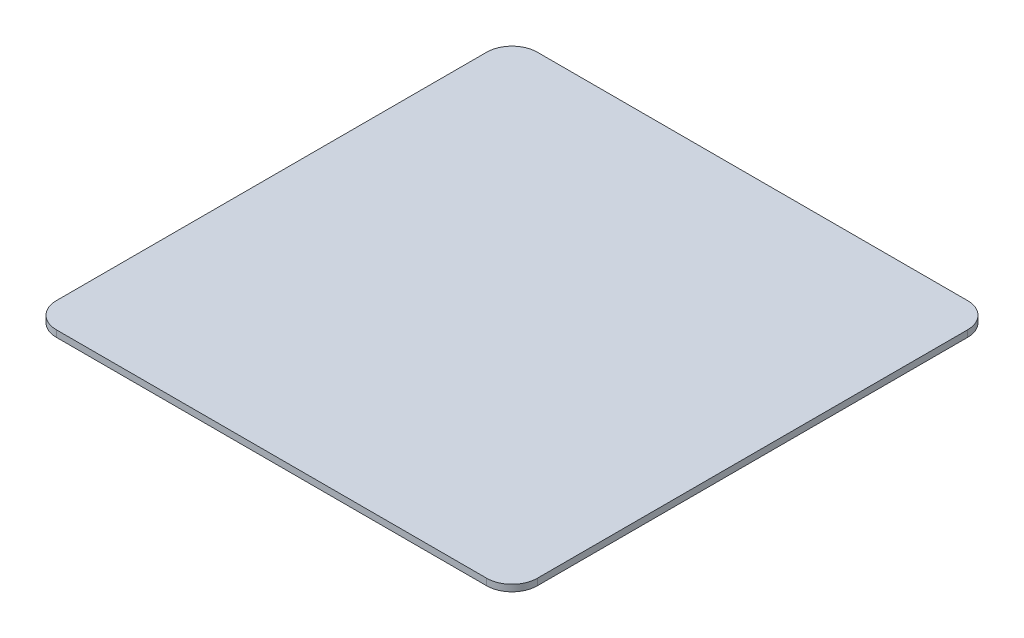
ISO-10303-21;
HEADER;
FILE_DESCRIPTION(('STEP AP214'),'2;1');
FILE_NAME('part.step','',(''),(''),'','','');
FILE_SCHEMA(('AUTOMOTIVE_DESIGN { 1 0 10303 214 1 1 1 1 }'));
ENDSEC;
DATA;
#1=APPLICATION_CONTEXT('core data for automotive mechanical design processes');
#2=APPLICATION_PROTOCOL_DEFINITION('international standard','automotive_design',2000,#1);
#3=PRODUCT_CONTEXT('',#1,'mechanical');
#4=PRODUCT('Part','Part','',(#3));
#5=PRODUCT_RELATED_PRODUCT_CATEGORY('part','',(#4));
#6=PRODUCT_DEFINITION_FORMATION('','',#4);
#7=PRODUCT_DEFINITION_CONTEXT('part definition',#1,'design');
#8=PRODUCT_DEFINITION('design','',#6,#7);
#9=PRODUCT_DEFINITION_SHAPE('','',#8);
#10=(LENGTH_UNIT() NAMED_UNIT(*) SI_UNIT(.MILLI.,.METRE.));
#11=(NAMED_UNIT(*) PLANE_ANGLE_UNIT() SI_UNIT($,.RADIAN.));
#12=(NAMED_UNIT(*) SI_UNIT($,.STERADIAN.) SOLID_ANGLE_UNIT());
#13=UNCERTAINTY_MEASURE_WITH_UNIT(LENGTH_MEASURE(1.E-05),#10,'distance_accuracy_value','');
#14=(GEOMETRIC_REPRESENTATION_CONTEXT(3) GLOBAL_UNCERTAINTY_ASSIGNED_CONTEXT((#13)) GLOBAL_UNIT_ASSIGNED_CONTEXT((#10,
#11,#12)) REPRESENTATION_CONTEXT('',''));
#15=CARTESIAN_POINT('',(0.,0.,0.));
#16=DIRECTION('',(0.,0.,1.));
#17=DIRECTION('',(1.,0.,0.));
#18=AXIS2_PLACEMENT_3D('',#15,#16,#17);
#19=CARTESIAN_POINT('',(47.5,0.65,47.5));
#20=DIRECTION('',(-1.,0.,0.));
#21=DIRECTION('',(0.,0.,1.));
#22=AXIS2_PLACEMENT_3D('',#19,#20,#21);
#23=PLANE('',#22);
#24=DIRECTION('',(0.,0.,-1.));
#25=VECTOR('',#24,1.);
#26=CARTESIAN_POINT('',(47.5,-0.65,47.5));
#27=LINE('',#26,#25);
#28=CARTESIAN_POINT('',(47.5,-0.65,42.5));
#29=VERTEX_POINT('',#28);
#30=CARTESIAN_POINT('',(47.5,-0.65,-42.5));
#31=VERTEX_POINT('',#30);
#32=EDGE_CURVE('E140',#29,#31,#27,.T.);
#33=ORIENTED_EDGE('',*,*,#32,.T.);
#34=DIRECTION('',(0.,-1.,0.));
#35=VECTOR('',#34,1.);
#36=CARTESIAN_POINT('',(47.5,0.65,-42.5));
#37=LINE('',#36,#35);
#38=CARTESIAN_POINT('',(47.5,0.65,-42.5));
#39=VERTEX_POINT('',#38);
#40=EDGE_CURVE('E174',#31,#39,#37,.F.);
#41=ORIENTED_EDGE('',*,*,#40,.T.);
#42=DIRECTION('',(0.,0.,-1.));
#43=VECTOR('',#42,1.);
#44=CARTESIAN_POINT('',(47.5,0.65,47.5));
#45=LINE('',#44,#43);
#46=CARTESIAN_POINT('',(47.5,0.65,42.5));
#47=VERTEX_POINT('',#46);
#48=EDGE_CURVE('E138',#47,#39,#45,.T.);
#49=ORIENTED_EDGE('',*,*,#48,.F.);
#50=DIRECTION('',(0.,-1.,0.));
#51=VECTOR('',#50,1.);
#52=CARTESIAN_POINT('',(47.5,0.65,42.5));
#53=LINE('',#52,#51);
#54=EDGE_CURVE('E170',#47,#29,#53,.T.);
#55=ORIENTED_EDGE('',*,*,#54,.T.);
#56=EDGE_LOOP('',(#33,#41,#49,#55));
#57=FACE_BOUND('',#56,.T.);
#58=ADVANCED_FACE('F39',(#57),#23,.F.);
#59=CARTESIAN_POINT('',(-47.5,0.65,-47.5));
#60=DIRECTION('',(0.,0.,1.));
#61=DIRECTION('',(1.,0.,0.));
#62=AXIS2_PLACEMENT_3D('',#59,#60,#61);
#63=PLANE('',#62);
#64=DIRECTION('',(-1.,0.,0.));
#65=VECTOR('',#64,1.);
#66=CARTESIAN_POINT('',(-47.5,-0.65,-47.5));
#67=LINE('',#66,#65);
#68=CARTESIAN_POINT('',(42.5,-0.65,-47.5));
#69=VERTEX_POINT('',#68);
#70=CARTESIAN_POINT('',(-42.5,-0.65,-47.5));
#71=VERTEX_POINT('',#70);
#72=EDGE_CURVE('E134',#69,#71,#67,.T.);
#73=ORIENTED_EDGE('',*,*,#72,.T.);
#74=DIRECTION('',(0.,-1.,0.));
#75=VECTOR('',#74,1.);
#76=CARTESIAN_POINT('',(-42.5,0.65,-47.5));
#77=LINE('',#76,#75);
#78=CARTESIAN_POINT('',(-42.5,0.65,-47.5));
#79=VERTEX_POINT('',#78);
#80=EDGE_CURVE('E110',#71,#79,#77,.F.);
#81=ORIENTED_EDGE('',*,*,#80,.T.);
#82=DIRECTION('',(-1.,0.,0.));
#83=VECTOR('',#82,1.);
#84=CARTESIAN_POINT('',(-47.5,0.65,-47.5));
#85=LINE('',#84,#83);
#86=CARTESIAN_POINT('',(42.5,0.65,-47.5));
#87=VERTEX_POINT('',#86);
#88=EDGE_CURVE('E193',#87,#79,#85,.T.);
#89=ORIENTED_EDGE('',*,*,#88,.F.);
#90=DIRECTION('',(0.,-1.,0.));
#91=VECTOR('',#90,1.);
#92=CARTESIAN_POINT('',(42.5,0.65,-47.5));
#93=LINE('',#92,#91);
#94=EDGE_CURVE('E116',#87,#69,#93,.T.);
#95=ORIENTED_EDGE('',*,*,#94,.T.);
#96=EDGE_LOOP('',(#73,#81,#89,#95));
#97=FACE_BOUND('',#96,.T.);
#98=ADVANCED_FACE('F214',(#97),#63,.F.);
#99=CARTESIAN_POINT('',(-47.5,0.65,47.5));
#100=DIRECTION('',(1.,0.,0.));
#101=DIRECTION('',(0.,0.,-1.));
#102=AXIS2_PLACEMENT_3D('',#99,#100,#101);
#103=PLANE('',#102);
#104=DIRECTION('',(0.,0.,1.));
#105=VECTOR('',#104,1.);
#106=CARTESIAN_POINT('',(-47.5,0.65,47.5));
#107=LINE('',#106,#105);
#108=CARTESIAN_POINT('',(-47.5,0.65,-42.5));
#109=VERTEX_POINT('',#108);
#110=CARTESIAN_POINT('',(-47.5,0.65,42.5));
#111=VERTEX_POINT('',#110);
#112=EDGE_CURVE('E125',#109,#111,#107,.T.);
#113=ORIENTED_EDGE('',*,*,#112,.F.);
#114=DIRECTION('',(0.,-1.,0.));
#115=VECTOR('',#114,1.);
#116=CARTESIAN_POINT('',(-47.5,0.65,-42.5));
#117=LINE('',#116,#115);
#118=CARTESIAN_POINT('',(-47.5,-0.65,-42.5));
#119=VERTEX_POINT('',#118);
#120=EDGE_CURVE('E109',#109,#119,#117,.T.);
#121=ORIENTED_EDGE('',*,*,#120,.T.);
#122=DIRECTION('',(0.,0.,1.));
#123=VECTOR('',#122,1.);
#124=CARTESIAN_POINT('',(-47.5,-0.65,47.5));
#125=LINE('',#124,#123);
#126=CARTESIAN_POINT('',(-47.5,-0.65,42.5));
#127=VERTEX_POINT('',#126);
#128=EDGE_CURVE('E123',#119,#127,#125,.T.);
#129=ORIENTED_EDGE('',*,*,#128,.T.);
#130=DIRECTION('',(0.,-1.,0.));
#131=VECTOR('',#130,1.);
#132=CARTESIAN_POINT('',(-47.5,0.65,42.5));
#133=LINE('',#132,#131);
#134=EDGE_CURVE('E128',#127,#111,#133,.F.);
#135=ORIENTED_EDGE('',*,*,#134,.T.);
#136=EDGE_LOOP('',(#113,#121,#129,#135));
#137=FACE_BOUND('',#136,.T.);
#138=ADVANCED_FACE('F122',(#137),#103,.F.);
#139=CARTESIAN_POINT('',(-47.5,0.65,47.5));
#140=DIRECTION('',(0.,0.,-1.));
#141=DIRECTION('',(-1.,0.,0.));
#142=AXIS2_PLACEMENT_3D('',#139,#140,#141);
#143=PLANE('',#142);
#144=DIRECTION('',(1.,0.,0.));
#145=VECTOR('',#144,1.);
#146=CARTESIAN_POINT('',(-47.5,-0.65,47.5));
#147=LINE('',#146,#145);
#148=CARTESIAN_POINT('',(-42.5,-0.65,47.5));
#149=VERTEX_POINT('',#148);
#150=CARTESIAN_POINT('',(42.5,-0.65,47.5));
#151=VERTEX_POINT('',#150);
#152=EDGE_CURVE('E133',#149,#151,#147,.T.);
#153=ORIENTED_EDGE('',*,*,#152,.T.);
#154=DIRECTION('',(0.,-1.,0.));
#155=VECTOR('',#154,1.);
#156=CARTESIAN_POINT('',(42.5,0.65,47.5));
#157=LINE('',#156,#155);
#158=CARTESIAN_POINT('',(42.5,0.65,47.5));
#159=VERTEX_POINT('',#158);
#160=EDGE_CURVE('E11',#151,#159,#157,.F.);
#161=ORIENTED_EDGE('',*,*,#160,.T.);
#162=DIRECTION('',(1.,0.,0.));
#163=VECTOR('',#162,1.);
#164=CARTESIAN_POINT('',(-47.5,0.65,47.5));
#165=LINE('',#164,#163);
#166=CARTESIAN_POINT('',(-42.5,0.65,47.5));
#167=VERTEX_POINT('',#166);
#168=EDGE_CURVE('E145',#167,#159,#165,.T.);
#169=ORIENTED_EDGE('',*,*,#168,.F.);
#170=DIRECTION('',(0.,-1.,0.));
#171=VECTOR('',#170,1.);
#172=CARTESIAN_POINT('',(-42.5,0.65,47.5));
#173=LINE('',#172,#171);
#174=EDGE_CURVE('E48',#167,#149,#173,.T.);
#175=ORIENTED_EDGE('',*,*,#174,.T.);
#176=EDGE_LOOP('',(#153,#161,#169,#175));
#177=FACE_BOUND('',#176,.T.);
#178=ADVANCED_FACE('F179',(#177),#143,.F.);
#179=CARTESIAN_POINT('',(0.,0.65,0.));
#180=DIRECTION('',(0.,-1.,0.));
#181=DIRECTION('',(0.,0.,-1.));
#182=AXIS2_PLACEMENT_3D('',#179,#180,#181);
#183=PLANE('',#182);
#184=ORIENTED_EDGE('',*,*,#88,.T.);
#185=CARTESIAN_POINT('',(-42.5,0.65,-42.5));
#186=DIRECTION('',(0.,-1.,0.));
#187=DIRECTION('',(0.,0.,-1.));
#188=AXIS2_PLACEMENT_3D('',#185,#186,#187);
#189=CIRCLE('',#188,5.);
#190=EDGE_CURVE('E167',#79,#109,#189,.F.);
#191=ORIENTED_EDGE('',*,*,#190,.T.);
#192=ORIENTED_EDGE('',*,*,#112,.T.);
#193=CARTESIAN_POINT('',(-42.5,0.65,42.5));
#194=DIRECTION('',(0.,-1.,0.));
#195=DIRECTION('',(0.,0.,-1.));
#196=AXIS2_PLACEMENT_3D('',#193,#194,#195);
#197=CIRCLE('',#196,5.);
#198=EDGE_CURVE('E60',#111,#167,#197,.F.);
#199=ORIENTED_EDGE('',*,*,#198,.T.);
#200=ORIENTED_EDGE('',*,*,#168,.T.);
#201=CARTESIAN_POINT('',(42.5,0.65,42.5));
#202=DIRECTION('',(0.,-1.,0.));
#203=DIRECTION('',(0.,0.,-1.));
#204=AXIS2_PLACEMENT_3D('',#201,#202,#203);
#205=CIRCLE('',#204,5.);
#206=EDGE_CURVE('E161',#159,#47,#205,.F.);
#207=ORIENTED_EDGE('',*,*,#206,.T.);
#208=ORIENTED_EDGE('',*,*,#48,.T.);
#209=CARTESIAN_POINT('',(42.5,0.65,-42.5));
#210=DIRECTION('',(0.,-1.,0.));
#211=DIRECTION('',(0.,0.,-1.));
#212=AXIS2_PLACEMENT_3D('',#209,#210,#211);
#213=CIRCLE('',#212,5.);
#214=EDGE_CURVE('E164',#39,#87,#213,.F.);
#215=ORIENTED_EDGE('',*,*,#214,.T.);
#216=EDGE_LOOP('',(#184,#191,#192,#199,#200,#207,#208,#215));
#217=FACE_BOUND('',#216,.T.);
#218=ADVANCED_FACE('F203',(#217),#183,.F.);
#219=CARTESIAN_POINT('',(0.,-0.65,0.));
#220=DIRECTION('',(0.,-1.,0.));
#221=DIRECTION('',(0.,0.,-1.));
#222=AXIS2_PLACEMENT_3D('',#219,#220,#221);
#223=PLANE('',#222);
#224=ORIENTED_EDGE('',*,*,#128,.F.);
#225=CARTESIAN_POINT('',(-42.5,-0.65,-42.5));
#226=DIRECTION('',(0.,-1.,0.));
#227=DIRECTION('',(0.,0.,-1.));
#228=AXIS2_PLACEMENT_3D('',#225,#226,#227);
#229=CIRCLE('',#228,5.);
#230=EDGE_CURVE('E105',#119,#71,#229,.T.);
#231=ORIENTED_EDGE('',*,*,#230,.T.);
#232=ORIENTED_EDGE('',*,*,#72,.F.);
#233=CARTESIAN_POINT('',(42.5,-0.65,-42.5));
#234=DIRECTION('',(0.,-1.,0.));
#235=DIRECTION('',(0.,0.,-1.));
#236=AXIS2_PLACEMENT_3D('',#233,#234,#235);
#237=CIRCLE('',#236,5.);
#238=EDGE_CURVE('E117',#69,#31,#237,.T.);
#239=ORIENTED_EDGE('',*,*,#238,.T.);
#240=ORIENTED_EDGE('',*,*,#32,.F.);
#241=CARTESIAN_POINT('',(42.5,-0.65,42.5));
#242=DIRECTION('',(0.,-1.,0.));
#243=DIRECTION('',(0.,0.,-1.));
#244=AXIS2_PLACEMENT_3D('',#241,#242,#243);
#245=CIRCLE('',#244,5.);
#246=EDGE_CURVE('E149',#29,#151,#245,.T.);
#247=ORIENTED_EDGE('',*,*,#246,.T.);
#248=ORIENTED_EDGE('',*,*,#152,.F.);
#249=CARTESIAN_POINT('',(-42.5,-0.65,42.5));
#250=DIRECTION('',(0.,-1.,0.));
#251=DIRECTION('',(0.,0.,-1.));
#252=AXIS2_PLACEMENT_3D('',#249,#250,#251);
#253=CIRCLE('',#252,5.);
#254=EDGE_CURVE('E127',#149,#127,#253,.T.);
#255=ORIENTED_EDGE('',*,*,#254,.T.);
#256=EDGE_LOOP('',(#224,#231,#232,#239,#240,#247,#248,#255));
#257=FACE_BOUND('',#256,.T.);
#258=ADVANCED_FACE('F130',(#257),#223,.T.);
#259=CARTESIAN_POINT('',(-42.5,0.65,-42.5));
#260=DIRECTION('',(0.,-1.,0.));
#261=DIRECTION('',(0.,0.,-1.));
#262=AXIS2_PLACEMENT_3D('',#259,#260,#261);
#263=CYLINDRICAL_SURFACE('',#262,5.);
#264=ORIENTED_EDGE('',*,*,#190,.F.);
#265=ORIENTED_EDGE('',*,*,#80,.F.);
#266=ORIENTED_EDGE('',*,*,#230,.F.);
#267=ORIENTED_EDGE('',*,*,#120,.F.);
#268=EDGE_LOOP('',(#264,#265,#266,#267));
#269=FACE_BOUND('',#268,.T.);
#270=ADVANCED_FACE('F108',(#269),#263,.T.);
#271=CARTESIAN_POINT('',(42.5,0.65,-42.5));
#272=DIRECTION('',(0.,-1.,0.));
#273=DIRECTION('',(0.,0.,-1.));
#274=AXIS2_PLACEMENT_3D('',#271,#272,#273);
#275=CYLINDRICAL_SURFACE('',#274,5.);
#276=ORIENTED_EDGE('',*,*,#214,.F.);
#277=ORIENTED_EDGE('',*,*,#40,.F.);
#278=ORIENTED_EDGE('',*,*,#238,.F.);
#279=ORIENTED_EDGE('',*,*,#94,.F.);
#280=EDGE_LOOP('',(#276,#277,#278,#279));
#281=FACE_BOUND('',#280,.T.);
#282=ADVANCED_FACE('F225',(#281),#275,.T.);
#283=CARTESIAN_POINT('',(42.5,0.65,42.5));
#284=DIRECTION('',(0.,-1.,0.));
#285=DIRECTION('',(0.,0.,-1.));
#286=AXIS2_PLACEMENT_3D('',#283,#284,#285);
#287=CYLINDRICAL_SURFACE('',#286,5.);
#288=ORIENTED_EDGE('',*,*,#206,.F.);
#289=ORIENTED_EDGE('',*,*,#160,.F.);
#290=ORIENTED_EDGE('',*,*,#246,.F.);
#291=ORIENTED_EDGE('',*,*,#54,.F.);
#292=EDGE_LOOP('',(#288,#289,#290,#291));
#293=FACE_BOUND('',#292,.T.);
#294=ADVANCED_FACE('F186',(#293),#287,.T.);
#295=CARTESIAN_POINT('',(-42.5,0.65,42.5));
#296=DIRECTION('',(0.,-1.,0.));
#297=DIRECTION('',(0.,0.,-1.));
#298=AXIS2_PLACEMENT_3D('',#295,#296,#297);
#299=CYLINDRICAL_SURFACE('',#298,5.);
#300=ORIENTED_EDGE('',*,*,#198,.F.);
#301=ORIENTED_EDGE('',*,*,#134,.F.);
#302=ORIENTED_EDGE('',*,*,#254,.F.);
#303=ORIENTED_EDGE('',*,*,#174,.F.);
#304=EDGE_LOOP('',(#300,#301,#302,#303));
#305=FACE_BOUND('',#304,.T.);
#306=ADVANCED_FACE('F41',(#305),#299,.T.);
#307=CLOSED_SHELL('',(#58,#98,#138,#178,#218,#258,#270,#282,#294,#306));
#308=MANIFOLD_SOLID_BREP('B2',#307);
#309=ADVANCED_BREP_SHAPE_REPRESENTATION('',(#18,#308),#14);
#310=SHAPE_DEFINITION_REPRESENTATION(#9,#309);
ENDSEC;
END-ISO-10303-21;
